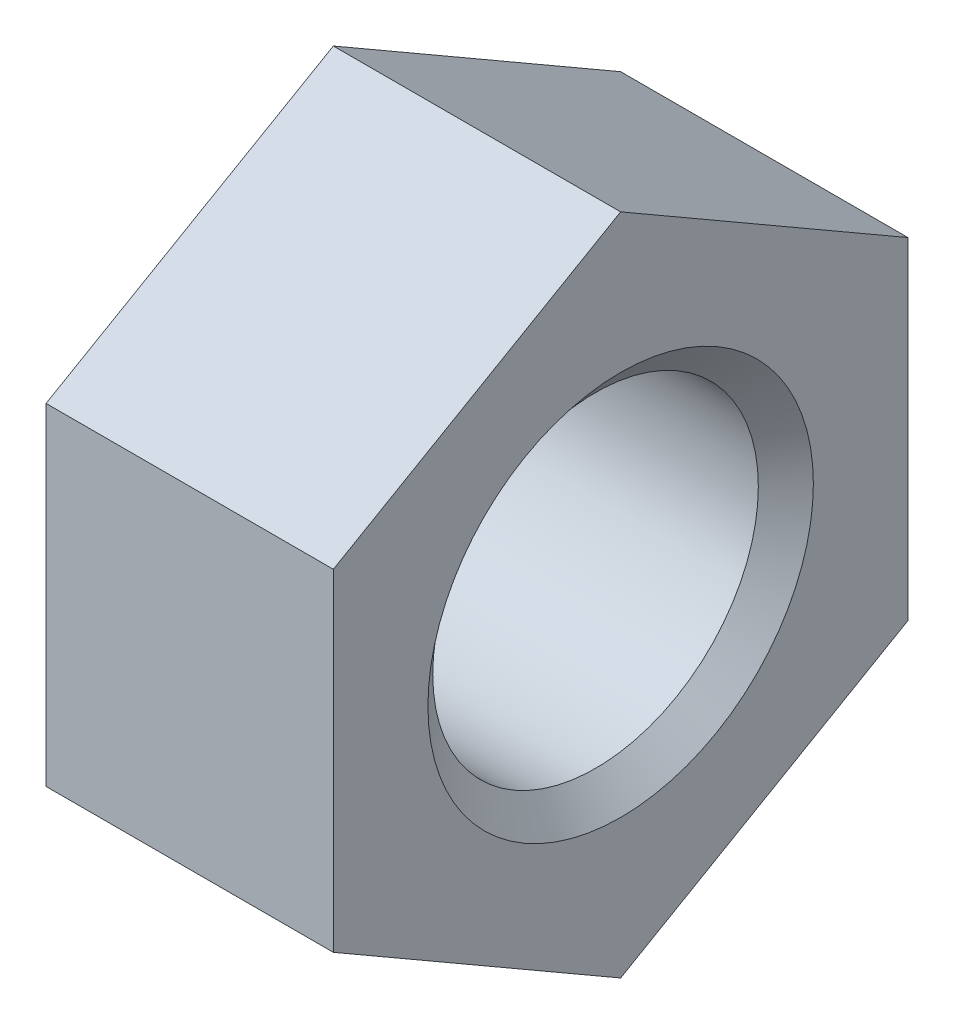
ISO-10303-21;
HEADER;
FILE_DESCRIPTION(('STEP AP214'),'2;1');
FILE_NAME('part.step','',(''),(''),'','','');
FILE_SCHEMA(('AUTOMOTIVE_DESIGN { 1 0 10303 214 1 1 1 1 }'));
ENDSEC;
DATA;
#1=APPLICATION_CONTEXT('core data for automotive mechanical design processes');
#2=APPLICATION_PROTOCOL_DEFINITION('international standard','automotive_design',2000,#1);
#3=PRODUCT_CONTEXT('',#1,'mechanical');
#4=PRODUCT('Part','Part','',(#3));
#5=PRODUCT_RELATED_PRODUCT_CATEGORY('part','',(#4));
#6=PRODUCT_DEFINITION_FORMATION('','',#4);
#7=PRODUCT_DEFINITION_CONTEXT('part definition',#1,'design');
#8=PRODUCT_DEFINITION('design','',#6,#7);
#9=PRODUCT_DEFINITION_SHAPE('','',#8);
#10=(LENGTH_UNIT() NAMED_UNIT(*) SI_UNIT(.MILLI.,.METRE.));
#11=(NAMED_UNIT(*) PLANE_ANGLE_UNIT() SI_UNIT($,.RADIAN.));
#12=(NAMED_UNIT(*) SI_UNIT($,.STERADIAN.) SOLID_ANGLE_UNIT());
#13=UNCERTAINTY_MEASURE_WITH_UNIT(LENGTH_MEASURE(1.E-05),#10,'distance_accuracy_value','');
#14=(GEOMETRIC_REPRESENTATION_CONTEXT(3) GLOBAL_UNCERTAINTY_ASSIGNED_CONTEXT((#13)) GLOBAL_UNIT_ASSIGNED_CONTEXT((#10,
#11,#12)) REPRESENTATION_CONTEXT('',''));
#15=CARTESIAN_POINT('',(0.,0.,0.));
#16=DIRECTION('',(0.,0.,1.));
#17=DIRECTION('',(1.,0.,0.));
#18=AXIS2_PLACEMENT_3D('',#15,#16,#17);
#19=CARTESIAN_POINT('',(6.,-6.92820323027555,0.));
#20=DIRECTION('',(0.,0.866025403784438,0.5));
#21=DIRECTION('',(0.,-0.5,0.866025403784439));
#22=AXIS2_PLACEMENT_3D('',#19,#20,#21);
#23=PLANE('',#22);
#24=DIRECTION('',(0.,0.5,-0.866025403784438));
#25=VECTOR('',#24,1.);
#26=CARTESIAN_POINT('',(0.,-6.92820323027555,0.));
#27=LINE('',#26,#25);
#28=CARTESIAN_POINT('',(0.,-6.92820323027555,0.));
#29=VERTEX_POINT('',#28);
#30=CARTESIAN_POINT('',(0.,-3.46410161513777,-6.00000000000003));
#31=VERTEX_POINT('',#30);
#32=EDGE_CURVE('E125',#29,#31,#27,.T.);
#33=ORIENTED_EDGE('',*,*,#32,.T.);
#34=DIRECTION('',(-1.,0.,0.));
#35=VECTOR('',#34,1.);
#36=CARTESIAN_POINT('',(6.,-3.46410161513777,-6.00000000000003));
#37=LINE('',#36,#35);
#38=CARTESIAN_POINT('',(6.,-3.46410161513777,-6.00000000000003));
#39=VERTEX_POINT('',#38);
#40=EDGE_CURVE('E11',#39,#31,#37,.T.);
#41=ORIENTED_EDGE('',*,*,#40,.F.);
#42=DIRECTION('',(0.,0.5,-0.866025403784438));
#43=VECTOR('',#42,1.);
#44=CARTESIAN_POINT('',(6.,-6.92820323027555,0.));
#45=LINE('',#44,#43);
#46=CARTESIAN_POINT('',(6.,-6.92820323027555,0.));
#47=VERTEX_POINT('',#46);
#48=EDGE_CURVE('E136',#47,#39,#45,.T.);
#49=ORIENTED_EDGE('',*,*,#48,.F.);
#50=DIRECTION('',(-1.,0.,0.));
#51=VECTOR('',#50,1.);
#52=CARTESIAN_POINT('',(6.,-6.92820323027555,0.));
#53=LINE('',#52,#51);
#54=EDGE_CURVE('E121',#47,#29,#53,.T.);
#55=ORIENTED_EDGE('',*,*,#54,.T.);
#56=EDGE_LOOP('',(#33,#41,#49,#55));
#57=FACE_BOUND('',#56,.T.);
#58=ADVANCED_FACE('F41',(#57),#23,.F.);
#59=CARTESIAN_POINT('',(6.,-3.46410161513777,-6.00000000000003));
#60=DIRECTION('',(0.,0.,1.));
#61=DIRECTION('',(1.,0.,0.));
#62=AXIS2_PLACEMENT_3D('',#59,#60,#61);
#63=PLANE('',#62);
#64=DIRECTION('',(0.,1.,0.));
#65=VECTOR('',#64,1.);
#66=CARTESIAN_POINT('',(0.,-3.46410161513777,-6.00000000000003));
#67=LINE('',#66,#65);
#68=CARTESIAN_POINT('',(0.,3.46410161513778,-6.00000000000003));
#69=VERTEX_POINT('',#68);
#70=EDGE_CURVE('E128',#31,#69,#67,.T.);
#71=ORIENTED_EDGE('',*,*,#70,.T.);
#72=DIRECTION('',(-1.,0.,0.));
#73=VECTOR('',#72,1.);
#74=CARTESIAN_POINT('',(6.,3.46410161513778,-6.00000000000003));
#75=LINE('',#74,#73);
#76=CARTESIAN_POINT('',(6.,3.46410161513778,-6.00000000000003));
#77=VERTEX_POINT('',#76);
#78=EDGE_CURVE('E49',#77,#69,#75,.T.);
#79=ORIENTED_EDGE('',*,*,#78,.F.);
#80=DIRECTION('',(0.,1.,0.));
#81=VECTOR('',#80,1.);
#82=CARTESIAN_POINT('',(6.,-3.46410161513777,-6.00000000000003));
#83=LINE('',#82,#81);
#84=EDGE_CURVE('E94',#39,#77,#83,.T.);
#85=ORIENTED_EDGE('',*,*,#84,.F.);
#86=ORIENTED_EDGE('',*,*,#40,.T.);
#87=EDGE_LOOP('',(#71,#79,#85,#86));
#88=FACE_BOUND('',#87,.T.);
#89=ADVANCED_FACE('F161',(#88),#63,.F.);
#90=CARTESIAN_POINT('',(6.,3.46410161513778,-6.00000000000003));
#91=DIRECTION('',(0.,-0.866025403784439,0.5));
#92=DIRECTION('',(0.,-0.5,-0.866025403784439));
#93=AXIS2_PLACEMENT_3D('',#90,#91,#92);
#94=PLANE('',#93);
#95=DIRECTION('',(0.,0.5,0.866025403784439));
#96=VECTOR('',#95,1.);
#97=CARTESIAN_POINT('',(0.,3.46410161513778,-6.00000000000003));
#98=LINE('',#97,#96);
#99=CARTESIAN_POINT('',(0.,6.92820323027555,0.));
#100=VERTEX_POINT('',#99);
#101=EDGE_CURVE('E131',#69,#100,#98,.T.);
#102=ORIENTED_EDGE('',*,*,#101,.T.);
#103=DIRECTION('',(-1.,0.,0.));
#104=VECTOR('',#103,1.);
#105=CARTESIAN_POINT('',(6.,6.92820323027555,0.));
#106=LINE('',#105,#104);
#107=CARTESIAN_POINT('',(6.,6.92820323027555,0.));
#108=VERTEX_POINT('',#107);
#109=EDGE_CURVE('E116',#108,#100,#106,.T.);
#110=ORIENTED_EDGE('',*,*,#109,.F.);
#111=DIRECTION('',(0.,0.5,0.866025403784439));
#112=VECTOR('',#111,1.);
#113=CARTESIAN_POINT('',(6.,3.46410161513778,-6.00000000000003));
#114=LINE('',#113,#112);
#115=EDGE_CURVE('E107',#77,#108,#114,.T.);
#116=ORIENTED_EDGE('',*,*,#115,.F.);
#117=ORIENTED_EDGE('',*,*,#78,.T.);
#118=EDGE_LOOP('',(#102,#110,#116,#117));
#119=FACE_BOUND('',#118,.T.);
#120=ADVANCED_FACE('F142',(#119),#94,.F.);
#121=CARTESIAN_POINT('',(6.,6.92820323027555,0.));
#122=DIRECTION('',(0.,-0.866025403784439,-0.5));
#123=DIRECTION('',(0.,0.5,-0.866025403784439));
#124=AXIS2_PLACEMENT_3D('',#121,#122,#123);
#125=PLANE('',#124);
#126=DIRECTION('',(0.,-0.5,0.866025403784439));
#127=VECTOR('',#126,1.);
#128=CARTESIAN_POINT('',(0.,6.92820323027555,0.));
#129=LINE('',#128,#127);
#130=CARTESIAN_POINT('',(0.,3.46410161513778,6.00000000000003));
#131=VERTEX_POINT('',#130);
#132=EDGE_CURVE('E115',#100,#131,#129,.T.);
#133=ORIENTED_EDGE('',*,*,#132,.T.);
#134=DIRECTION('',(-1.,0.,0.));
#135=VECTOR('',#134,1.);
#136=CARTESIAN_POINT('',(6.,3.46410161513778,6.00000000000003));
#137=LINE('',#136,#135);
#138=CARTESIAN_POINT('',(6.,3.46410161513778,6.00000000000003));
#139=VERTEX_POINT('',#138);
#140=EDGE_CURVE('E112',#139,#131,#137,.T.);
#141=ORIENTED_EDGE('',*,*,#140,.F.);
#142=DIRECTION('',(0.,-0.5,0.866025403784439));
#143=VECTOR('',#142,1.);
#144=CARTESIAN_POINT('',(6.,6.92820323027555,0.));
#145=LINE('',#144,#143);
#146=EDGE_CURVE('E101',#108,#139,#145,.T.);
#147=ORIENTED_EDGE('',*,*,#146,.F.);
#148=ORIENTED_EDGE('',*,*,#109,.T.);
#149=EDGE_LOOP('',(#133,#141,#147,#148));
#150=FACE_BOUND('',#149,.T.);
#151=ADVANCED_FACE('F113',(#150),#125,.F.);
#152=CARTESIAN_POINT('',(6.,3.46410161513778,6.00000000000003));
#153=DIRECTION('',(0.,0.,-1.));
#154=DIRECTION('',(0.,1.,0.));
#155=AXIS2_PLACEMENT_3D('',#152,#153,#154);
#156=PLANE('',#155);
#157=DIRECTION('',(0.,-1.,0.));
#158=VECTOR('',#157,1.);
#159=CARTESIAN_POINT('',(0.,3.46410161513778,6.00000000000003));
#160=LINE('',#159,#158);
#161=CARTESIAN_POINT('',(0.,-3.46410161513777,6.00000000000003));
#162=VERTEX_POINT('',#161);
#163=EDGE_CURVE('E80',#131,#162,#160,.T.);
#164=ORIENTED_EDGE('',*,*,#163,.T.);
#165=DIRECTION('',(-1.,0.,0.));
#166=VECTOR('',#165,1.);
#167=CARTESIAN_POINT('',(6.,-3.46410161513777,6.00000000000003));
#168=LINE('',#167,#166);
#169=CARTESIAN_POINT('',(6.,-3.46410161513777,6.00000000000003));
#170=VERTEX_POINT('',#169);
#171=EDGE_CURVE('E117',#170,#162,#168,.T.);
#172=ORIENTED_EDGE('',*,*,#171,.F.);
#173=DIRECTION('',(0.,-1.,0.));
#174=VECTOR('',#173,1.);
#175=CARTESIAN_POINT('',(6.,3.46410161513778,6.00000000000003));
#176=LINE('',#175,#174);
#177=EDGE_CURVE('E105',#139,#170,#176,.T.);
#178=ORIENTED_EDGE('',*,*,#177,.F.);
#179=ORIENTED_EDGE('',*,*,#140,.T.);
#180=EDGE_LOOP('',(#164,#172,#178,#179));
#181=FACE_BOUND('',#180,.T.);
#182=ADVANCED_FACE('F119',(#181),#156,.F.);
#183=CARTESIAN_POINT('',(6.,-3.46410161513777,6.00000000000003));
#184=DIRECTION('',(0.,0.866025403784439,-0.5));
#185=DIRECTION('',(0.,0.5,0.866025403784439));
#186=AXIS2_PLACEMENT_3D('',#183,#184,#185);
#187=PLANE('',#186);
#188=DIRECTION('',(0.,-0.5,-0.866025403784439));
#189=VECTOR('',#188,1.);
#190=CARTESIAN_POINT('',(0.,-3.46410161513777,6.00000000000003));
#191=LINE('',#190,#189);
#192=EDGE_CURVE('E86',#162,#29,#191,.T.);
#193=ORIENTED_EDGE('',*,*,#192,.T.);
#194=ORIENTED_EDGE('',*,*,#54,.F.);
#195=DIRECTION('',(0.,-0.5,-0.866025403784439));
#196=VECTOR('',#195,1.);
#197=CARTESIAN_POINT('',(6.,-3.46410161513777,6.00000000000003));
#198=LINE('',#197,#196);
#199=EDGE_CURVE('E57',#170,#47,#198,.T.);
#200=ORIENTED_EDGE('',*,*,#199,.F.);
#201=ORIENTED_EDGE('',*,*,#171,.T.);
#202=EDGE_LOOP('',(#193,#194,#200,#201));
#203=FACE_BOUND('',#202,.T.);
#204=ADVANCED_FACE('F149',(#203),#187,.F.);
#205=CARTESIAN_POINT('',(6.,0.,0.));
#206=DIRECTION('',(1.,0.,0.));
#207=DIRECTION('',(0.,0.,-1.));
#208=AXIS2_PLACEMENT_3D('',#205,#206,#207);
#209=PLANE('',#208);
#210=CARTESIAN_POINT('',(6.,0.,0.));
#211=DIRECTION('',(1.,0.,0.));
#212=DIRECTION('',(0.,0.,-1.));
#213=AXIS2_PLACEMENT_3D('',#210,#211,#212);
#214=CIRCLE('',#213,4.025);
#215=CARTESIAN_POINT('',(6.,0.,-4.025));
#216=VERTEX_POINT('',#215);
#217=EDGE_CURVE('E263',#216,#216,#214,.T.);
#218=ORIENTED_EDGE('',*,*,#217,.F.);
#219=EDGE_LOOP('',(#218));
#220=FACE_BOUND('',#219,.T.);
#221=ORIENTED_EDGE('',*,*,#48,.T.);
#222=ORIENTED_EDGE('',*,*,#84,.T.);
#223=ORIENTED_EDGE('',*,*,#115,.T.);
#224=ORIENTED_EDGE('',*,*,#146,.T.);
#225=ORIENTED_EDGE('',*,*,#177,.T.);
#226=ORIENTED_EDGE('',*,*,#199,.T.);
#227=EDGE_LOOP('',(#221,#222,#223,#224,#225,#226));
#228=FACE_BOUND('',#227,.T.);
#229=ADVANCED_FACE('F103',(#220,#228),#209,.T.);
#230=CARTESIAN_POINT('',(0.,0.,0.));
#231=DIRECTION('',(1.,0.,0.));
#232=DIRECTION('',(0.,0.,-1.));
#233=AXIS2_PLACEMENT_3D('',#230,#231,#232);
#234=PLANE('',#233);
#235=CARTESIAN_POINT('',(0.,0.,0.));
#236=DIRECTION('',(1.,0.,0.));
#237=DIRECTION('',(0.,0.,-1.));
#238=AXIS2_PLACEMENT_3D('',#235,#236,#237);
#239=CIRCLE('',#238,3.4);
#240=CARTESIAN_POINT('',(0.,0.,-3.4));
#241=VERTEX_POINT('',#240);
#242=EDGE_CURVE('E129',#241,#241,#239,.T.);
#243=ORIENTED_EDGE('',*,*,#242,.T.);
#244=EDGE_LOOP('',(#243));
#245=FACE_BOUND('',#244,.T.);
#246=ORIENTED_EDGE('',*,*,#32,.F.);
#247=ORIENTED_EDGE('',*,*,#192,.F.);
#248=ORIENTED_EDGE('',*,*,#163,.F.);
#249=ORIENTED_EDGE('',*,*,#132,.F.);
#250=ORIENTED_EDGE('',*,*,#101,.F.);
#251=ORIENTED_EDGE('',*,*,#70,.F.);
#252=EDGE_LOOP('',(#246,#247,#248,#249,#250,#251));
#253=FACE_BOUND('',#252,.T.);
#254=ADVANCED_FACE('F145',(#245,#253),#234,.F.);
#255=CARTESIAN_POINT('',(6.,0.,0.));
#256=DIRECTION('',(1.,0.,0.));
#257=DIRECTION('',(0.,0.,-1.));
#258=AXIS2_PLACEMENT_3D('',#255,#256,#257);
#259=CYLINDRICAL_SURFACE('',#258,3.4);
#260=ORIENTED_EDGE('',*,*,#242,.F.);
#261=EDGE_LOOP('',(#260));
#262=FACE_BOUND('',#261,.T.);
#263=CARTESIAN_POINT('',(5.4755627305142,0.,0.));
#264=DIRECTION('',(1.,0.,0.));
#265=DIRECTION('',(0.,0.,-1.));
#266=AXIS2_PLACEMENT_3D('',#263,#264,#265);
#267=CIRCLE('',#266,3.4);
#268=CARTESIAN_POINT('',(5.4755627305142,0.,-3.4));
#269=VERTEX_POINT('',#268);
#270=EDGE_CURVE('E260',#269,#269,#267,.T.);
#271=ORIENTED_EDGE('',*,*,#270,.T.);
#272=EDGE_LOOP('',(#271));
#273=FACE_BOUND('',#272,.T.);
#274=ADVANCED_FACE('F201',(#262,#273),#259,.F.);
#275=CARTESIAN_POINT('',(6.,0.,0.));
#276=DIRECTION('',(1.,0.,0.));
#277=DIRECTION('',(0.,0.,-1.));
#278=AXIS2_PLACEMENT_3D('',#275,#276,#277);
#279=CONICAL_SURFACE('',#278,4.025,0.872664625997166);
#280=ORIENTED_EDGE('',*,*,#270,.F.);
#281=EDGE_LOOP('',(#280));
#282=FACE_BOUND('',#281,.T.);
#283=ORIENTED_EDGE('',*,*,#217,.T.);
#284=EDGE_LOOP('',(#283));
#285=FACE_BOUND('',#284,.T.);
#286=ADVANCED_FACE('F212',(#282,#285),#279,.F.);
#287=CLOSED_SHELL('',(#58,#89,#120,#151,#182,#204,#229,#254,#274,#286));
#288=MANIFOLD_SOLID_BREP('B2',#287);
#289=ADVANCED_BREP_SHAPE_REPRESENTATION('',(#18,#288),#14);
#290=SHAPE_DEFINITION_REPRESENTATION(#9,#289);
ENDSEC;
END-ISO-10303-21;
